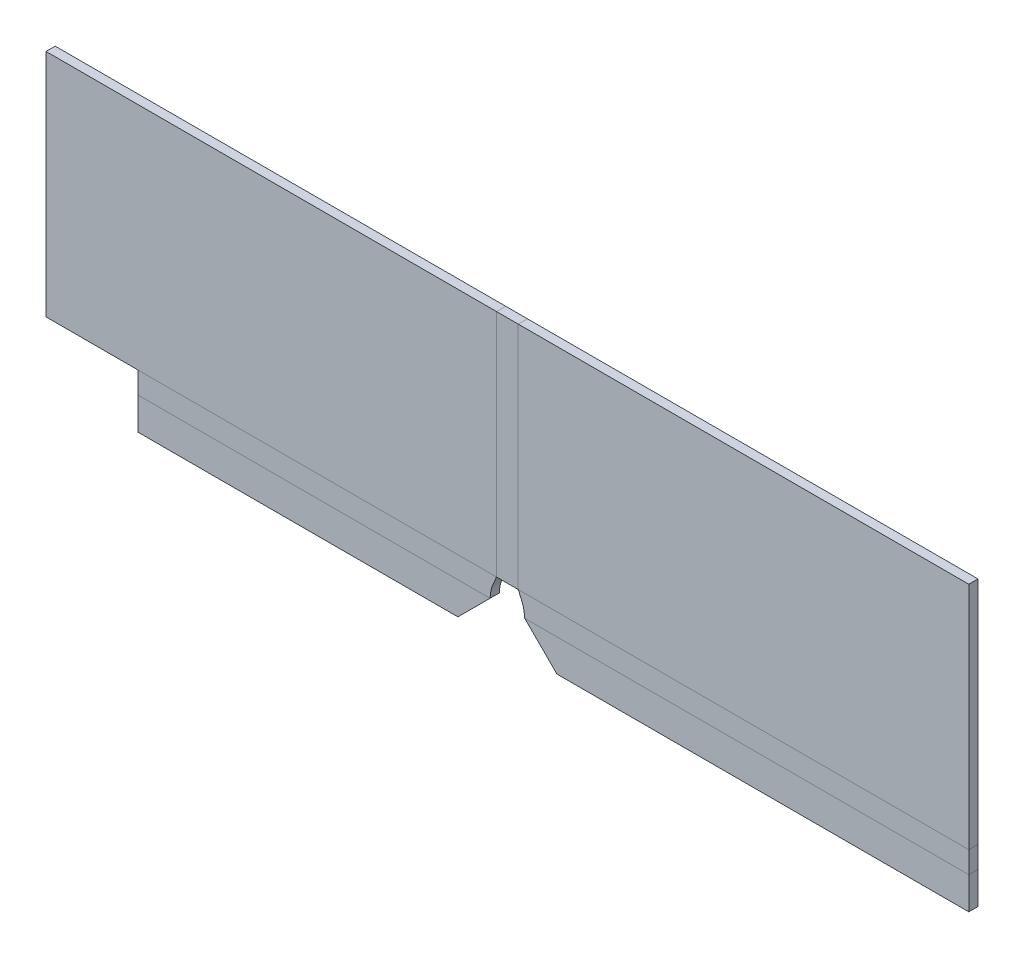
ISO-10303-21;
HEADER;
FILE_DESCRIPTION(('STEP AP214'),'2;1');
FILE_NAME('part.step','',(''),(''),'','','');
FILE_SCHEMA(('AUTOMOTIVE_DESIGN { 1 0 10303 214 1 1 1 1 }'));
ENDSEC;
DATA;
#1=APPLICATION_CONTEXT('core data for automotive mechanical design processes');
#2=APPLICATION_PROTOCOL_DEFINITION('international standard','automotive_design',2000,#1);
#3=PRODUCT_CONTEXT('',#1,'mechanical');
#4=PRODUCT('Part','Part','',(#3));
#5=PRODUCT_RELATED_PRODUCT_CATEGORY('part','',(#4));
#6=PRODUCT_DEFINITION_FORMATION('','',#4);
#7=PRODUCT_DEFINITION_CONTEXT('part definition',#1,'design');
#8=PRODUCT_DEFINITION('design','',#6,#7);
#9=PRODUCT_DEFINITION_SHAPE('','',#8);
#10=(LENGTH_UNIT() NAMED_UNIT(*) SI_UNIT(.MILLI.,.METRE.));
#11=(NAMED_UNIT(*) PLANE_ANGLE_UNIT() SI_UNIT($,.RADIAN.));
#12=(NAMED_UNIT(*) SI_UNIT($,.STERADIAN.) SOLID_ANGLE_UNIT());
#13=UNCERTAINTY_MEASURE_WITH_UNIT(LENGTH_MEASURE(1.E-05),#10,'distance_accuracy_value','');
#14=(GEOMETRIC_REPRESENTATION_CONTEXT(3) GLOBAL_UNCERTAINTY_ASSIGNED_CONTEXT((#13)) GLOBAL_UNIT_ASSIGNED_CONTEXT((#10,
#11,#12)) REPRESENTATION_CONTEXT('',''));
#15=CARTESIAN_POINT('',(0.,0.,0.));
#16=DIRECTION('',(0.,0.,1.));
#17=DIRECTION('',(1.,0.,0.));
#18=AXIS2_PLACEMENT_3D('',#15,#16,#17);
#19=CARTESIAN_POINT('',(1.28761101961531,0.,-2.));
#20=DIRECTION('',(0.,-1.,0.));
#21=DIRECTION('',(-1.,0.,0.));
#22=AXIS2_PLACEMENT_3D('',#19,#20,#21);
#23=PLANE('',#22);
#24=DIRECTION('',(0.,0.,1.));
#25=VECTOR('',#24,1.);
#26=CARTESIAN_POINT('',(-80.7123889803847,0.,1.05470321935075E-12));
#27=LINE('',#26,#25);
#28=CARTESIAN_POINT('',(-80.7123889803847,0.,1.05470321935075E-12));
#29=VERTEX_POINT('',#28);
#30=CARTESIAN_POINT('',(-80.7123889803847,0.,2.00000000000105));
#31=VERTEX_POINT('',#30);
#32=EDGE_CURVE('E104',#29,#31,#27,.T.);
#33=ORIENTED_EDGE('',*,*,#32,.T.);
#34=DIRECTION('',(1.,0.,0.));
#35=VECTOR('',#34,1.);
#36=CARTESIAN_POINT('',(-100.712388980385,0.,2.00000000000012));
#37=LINE('',#36,#35);
#38=CARTESIAN_POINT('',(-100.712388980385,0.,2.00000000000012));
#39=VERTEX_POINT('',#38);
#40=EDGE_CURVE('E92',#39,#31,#37,.T.);
#41=ORIENTED_EDGE('',*,*,#40,.F.);
#42=DIRECTION('',(0.,0.,-1.));
#43=VECTOR('',#42,1.);
#44=CARTESIAN_POINT('',(-100.712388980385,0.,2.00000000000012));
#45=LINE('',#44,#43);
#46=CARTESIAN_POINT('',(-100.712388980385,0.,1.24321427607463E-13));
#47=VERTEX_POINT('',#46);
#48=EDGE_CURVE('E103',#39,#47,#45,.T.);
#49=ORIENTED_EDGE('',*,*,#48,.T.);
#50=DIRECTION('',(1.,0.,0.));
#51=VECTOR('',#50,1.);
#52=CARTESIAN_POINT('',(-100.712388980385,0.,1.24321427607463E-13));
#53=LINE('',#52,#51);
#54=EDGE_CURVE('E109',#47,#29,#53,.T.);
#55=ORIENTED_EDGE('',*,*,#54,.T.);
#56=EDGE_LOOP('',(#33,#41,#49,#55));
#57=FACE_BOUND('',#56,.T.);
#58=ADVANCED_FACE('F51',(#57),#23,.T.);
#59=CARTESIAN_POINT('',(-100.712388980385,50.,1.24321427607463E-13));
#60=DIRECTION('',(0.,0.,-1.));
#61=DIRECTION('',(-1.,0.,0.));
#62=AXIS2_PLACEMENT_3D('',#59,#60,#61);
#63=PLANE('',#62);
#64=ORIENTED_EDGE('',*,*,#54,.F.);
#65=DIRECTION('',(0.,-1.,0.));
#66=VECTOR('',#65,1.);
#67=CARTESIAN_POINT('',(-100.712388980385,50.,1.24321427607463E-13));
#68=LINE('',#67,#66);
#69=CARTESIAN_POINT('',(-100.712388980385,50.,1.24321427607463E-13));
#70=VERTEX_POINT('',#69);
#71=EDGE_CURVE('E98',#70,#47,#68,.T.);
#72=ORIENTED_EDGE('',*,*,#71,.F.);
#73=DIRECTION('',(1.,0.,0.));
#74=VECTOR('',#73,1.);
#75=CARTESIAN_POINT('',(-100.712388980385,50.,1.24321427607463E-13));
#76=LINE('',#75,#74);
#77=CARTESIAN_POINT('',(-2.71238898038471,50.,0.));
#78=VERTEX_POINT('',#77);
#79=EDGE_CURVE('E105',#70,#78,#76,.T.);
#80=ORIENTED_EDGE('',*,*,#79,.T.);
#81=DIRECTION('',(0.,-1.,0.));
#82=VECTOR('',#81,1.);
#83=CARTESIAN_POINT('',(-2.71238898038469,50.,0.));
#84=LINE('',#83,#82);
#85=CARTESIAN_POINT('',(-2.71238898038469,0.,0.));
#86=VERTEX_POINT('',#85);
#87=EDGE_CURVE('E118',#78,#86,#84,.T.);
#88=ORIENTED_EDGE('',*,*,#87,.T.);
#89=DIRECTION('',(-1.,0.,0.));
#90=VECTOR('',#89,1.);
#91=CARTESIAN_POINT('',(-2.71238898038469,0.,0.));
#92=LINE('',#91,#90);
#93=EDGE_CURVE('E116',#86,#29,#92,.T.);
#94=ORIENTED_EDGE('',*,*,#93,.T.);
#95=EDGE_LOOP('',(#64,#72,#80,#88,#94));
#96=FACE_BOUND('',#95,.T.);
#97=ADVANCED_FACE('F233',(#96),#63,.T.);
#98=CARTESIAN_POINT('',(-100.712388980385,50.,2.00000000000012));
#99=DIRECTION('',(-1.,0.,0.));
#100=DIRECTION('',(0.,0.,1.));
#101=AXIS2_PLACEMENT_3D('',#98,#99,#100);
#102=PLANE('',#101);
#103=ORIENTED_EDGE('',*,*,#48,.F.);
#104=DIRECTION('',(0.,-1.,0.));
#105=VECTOR('',#104,1.);
#106=CARTESIAN_POINT('',(-100.712388980385,50.,2.00000000000012));
#107=LINE('',#106,#105);
#108=CARTESIAN_POINT('',(-100.712388980385,50.,2.00000000000012));
#109=VERTEX_POINT('',#108);
#110=EDGE_CURVE('E77',#109,#39,#107,.T.);
#111=ORIENTED_EDGE('',*,*,#110,.F.);
#112=DIRECTION('',(0.,0.,-1.));
#113=VECTOR('',#112,1.);
#114=CARTESIAN_POINT('',(-100.712388980385,50.,2.00000000000012));
#115=LINE('',#114,#113);
#116=EDGE_CURVE('E615',#109,#70,#115,.T.);
#117=ORIENTED_EDGE('',*,*,#116,.T.);
#118=ORIENTED_EDGE('',*,*,#71,.T.);
#119=EDGE_LOOP('',(#103,#111,#117,#118));
#120=FACE_BOUND('',#119,.T.);
#121=ADVANCED_FACE('F107',(#120),#102,.T.);
#122=CARTESIAN_POINT('',(-100.712388980385,50.,2.00000000000012));
#123=DIRECTION('',(0.,0.,-1.));
#124=DIRECTION('',(-1.,0.,0.));
#125=AXIS2_PLACEMENT_3D('',#122,#123,#124);
#126=PLANE('',#125);
#127=ORIENTED_EDGE('',*,*,#40,.T.);
#128=DIRECTION('',(-1.,0.,0.));
#129=VECTOR('',#128,1.);
#130=CARTESIAN_POINT('',(-2.71238898038467,0.,2.));
#131=LINE('',#130,#129);
#132=CARTESIAN_POINT('',(-2.71238898038471,0.,2.));
#133=VERTEX_POINT('',#132);
#134=EDGE_CURVE('E119',#133,#31,#131,.T.);
#135=ORIENTED_EDGE('',*,*,#134,.F.);
#136=DIRECTION('',(0.,-1.,0.));
#137=VECTOR('',#136,1.);
#138=CARTESIAN_POINT('',(-2.71238898038469,50.,2.));
#139=LINE('',#138,#137);
#140=CARTESIAN_POINT('',(-2.71238898038471,50.,2.));
#141=VERTEX_POINT('',#140);
#142=EDGE_CURVE('E61',#141,#133,#139,.T.);
#143=ORIENTED_EDGE('',*,*,#142,.F.);
#144=DIRECTION('',(1.,0.,0.));
#145=VECTOR('',#144,1.);
#146=CARTESIAN_POINT('',(-100.712388980385,50.,2.00000000000012));
#147=LINE('',#146,#145);
#148=EDGE_CURVE('E96',#109,#141,#147,.T.);
#149=ORIENTED_EDGE('',*,*,#148,.F.);
#150=ORIENTED_EDGE('',*,*,#110,.T.);
#151=EDGE_LOOP('',(#127,#135,#143,#149,#150));
#152=FACE_BOUND('',#151,.T.);
#153=ADVANCED_FACE('F90',(#152),#126,.F.);
#154=CARTESIAN_POINT('',(-2.71238898038469,50.,-2.));
#155=DIRECTION('',(0.,-1.,0.));
#156=DIRECTION('',(0.,0.,1.));
#157=AXIS2_PLACEMENT_3D('',#154,#155,#156);
#158=PLANE('',#157);
#159=ORIENTED_EDGE('',*,*,#148,.T.);
#160=DIRECTION('',(0.,0.,-1.));
#161=VECTOR('',#160,1.);
#162=CARTESIAN_POINT('',(-2.71238898038469,50.,2.));
#163=LINE('',#162,#161);
#164=EDGE_CURVE('E240',#141,#78,#163,.T.);
#165=ORIENTED_EDGE('',*,*,#164,.T.);
#166=ORIENTED_EDGE('',*,*,#79,.F.);
#167=ORIENTED_EDGE('',*,*,#116,.F.);
#168=EDGE_LOOP('',(#159,#165,#166,#167));
#169=FACE_BOUND('',#168,.T.);
#170=ADVANCED_FACE('F582',(#169),#158,.F.);
#171=CARTESIAN_POINT('',(-2.71238898038471,0.,4.7787675583159E-13));
#172=CARTESIAN_POINT('',(-2.94388208310796,-0.49037765062356,4.78170424739874E-13));
#173=CARTESIAN_POINT('',(-3.14082009192283,-0.92557395766604,4.78420257539936E-13));
#174=CARTESIAN_POINT('',(-3.38439446428259,-1.49559640285815,4.78729252577694E-13));
#175=CARTESIAN_POINT('',(-3.45694714825876,-1.67180854869358,4.78821291896558E-13));
#176=CARTESIAN_POINT('',(-3.55281801400737,-1.91543376360383,4.78942912334271E-13));
#177=CARTESIAN_POINT('',(-3.58261527588762,-1.99319333460009,4.78980712723411E-13));
#178=CARTESIAN_POINT('',(-3.6240716286541,-2.10465944013377,4.79033303671976E-13));
#179=CARTESIAN_POINT('',(-3.63735048956728,-2.14095260015154,4.79050149048973E-13));
#180=CARTESIAN_POINT('',(-3.65645889592357,-2.19409902743801,4.79074389705682E-13));
#181=CARTESIAN_POINT('',(-3.66269338387342,-2.2115989510768,4.79082298689788E-13));
#182=CARTESIAN_POINT('',(-3.67184264454482,-2.23752550834995,4.79093905313749E-13));
#183=CARTESIAN_POINT('',(-3.67485865289306,-2.24611380607682,4.79097731379704E-13));
#184=CARTESIAN_POINT('',(-3.67933204760208,-2.25891542062087,4.79103406265586E-13));
#185=CARTESIAN_POINT('',(-3.68081474286953,-2.26316915346118,4.79105287192039E-13));
#186=CARTESIAN_POINT('',(-3.68376326079998,-2.27164967512637,4.79109027640594E-13));
#187=CARTESIAN_POINT('',(-3.68480804718455,-2.2746592443585,4.7911035304197E-13));
#188=CARTESIAN_POINT('',(-3.92712456764235,-2.97519844123942,4.79417752386421E-13));
#189=CARTESIAN_POINT('',(-4.07376325862765,-3.78596484111149,4.79603776176276E-13));
#190=CARTESIAN_POINT('',(-4.12660254277965,-4.71238898038463,4.7967080735219E-13));
#191=CARTESIAN_POINT('',(-2.71238898038471,0.,2.00000000000048));
#192=CARTESIAN_POINT('',(-2.94388208310796,-0.49037765062356,2.00000000000048));
#193=CARTESIAN_POINT('',(-3.14082009192283,-0.92557395766604,2.00000000000048));
#194=CARTESIAN_POINT('',(-3.38439446428259,-1.49559640285815,2.00000000000048));
#195=CARTESIAN_POINT('',(-3.45694714825876,-1.67180854869358,2.00000000000048));
#196=CARTESIAN_POINT('',(-3.55281801400736,-1.91543376360383,2.00000000000048));
#197=CARTESIAN_POINT('',(-3.58261527588762,-1.99319333460009,2.00000000000048));
#198=CARTESIAN_POINT('',(-3.6240716286541,-2.10465944013377,2.00000000000048));
#199=CARTESIAN_POINT('',(-3.63735048956728,-2.14095260015154,2.00000000000048));
#200=CARTESIAN_POINT('',(-3.65645889592356,-2.19409902743801,2.00000000000048));
#201=CARTESIAN_POINT('',(-3.66269338387342,-2.2115989510768,2.00000000000048));
#202=CARTESIAN_POINT('',(-3.67184264454482,-2.23752550834995,2.00000000000048));
#203=CARTESIAN_POINT('',(-3.67485865289306,-2.24611380607682,2.00000000000048));
#204=CARTESIAN_POINT('',(-3.67933204760208,-2.25891542062087,2.00000000000048));
#205=CARTESIAN_POINT('',(-3.68081474286952,-2.26316915346118,2.00000000000048));
#206=CARTESIAN_POINT('',(-3.68376326079997,-2.27164967512637,2.00000000000048));
#207=CARTESIAN_POINT('',(-3.68480804718455,-2.2746592443585,2.00000000000048));
#208=CARTESIAN_POINT('',(-3.92712456764235,-2.97519844123942,2.00000000000048));
#209=CARTESIAN_POINT('',(-4.07376325862764,-3.78596484111149,2.00000000000048));
#210=CARTESIAN_POINT('',(-4.12660254277965,-4.71238898038463,2.00000000000048));
#211=B_SPLINE_SURFACE_WITH_KNOTS('',1,3,((#171,#172,#173,#174,#175,#176,#177,#178,#179,#180,
#181,#182,#183,#184,#185,#186,#187,#188,#189,#190),(#191,#192,#193,#194,#195,#196,#197,#198,
#199,#200,#201,#202,#203,#204,#205,#206,#207,#208,#209,#210)),.UNSPECIFIED.,.F.,.F.,.F.,(2,2),
(4,2,2,2,2,2,2,2,2,4),(0.,1.),(0.,0.25,0.375,0.4375,0.46875,0.484375,0.4921875,0.49609375,0.5,
1.),.UNSPECIFIED.);
#212=CARTESIAN_POINT('',(-2.71238898038471,0.,4.7787675583159E-13));
#213=CARTESIAN_POINT('',(-2.71238898038471,0.,2.00000000000048));
#214=B_SPLINE_CURVE_WITH_KNOTS('',1,(#212,#213),.UNSPECIFIED.,.F.,.F.,(2,2),(0.,1.),.UNSPECIFIED.);
#215=EDGE_CURVE('E12',#133,#86,#214,.F.);
#216=CARTESIAN_POINT('',(-2.71238898038471,0.,2.00000000000048));
#217=CARTESIAN_POINT('',(-3.40686828855445,-1.47113295187067,2.00000000000048));
#218=CARTESIAN_POINT('',(-3.68668646982376,-2.28008978076843,2.00000000000048));
#219=CARTESIAN_POINT('',(-4.04734361655164,-3.32275277147491,2.00000000000048));
#220=CARTESIAN_POINT('',(-4.12660254277965,-4.71238898038463,2.00000000000048));
#221=B_SPLINE_CURVE_WITH_KNOTS('',2,(#216,#217,#218,#219,#220),.UNSPECIFIED.,.F.,.F.,(3,2,3),
(0.,0.5,1.),.UNSPECIFIED.);
#222=CARTESIAN_POINT('',(-4.1266025427796,-4.71238898038468,2.00000000000002));
#223=VERTEX_POINT('',#222);
#224=EDGE_CURVE('E202',#133,#223,#221,.T.);
#225=CARTESIAN_POINT('',(-4.12660254277965,-4.71238898038463,2.00000000000048));
#226=CARTESIAN_POINT('',(-4.12660254277965,-4.71238898038463,4.7967080735219E-13));
#227=B_SPLINE_CURVE_WITH_KNOTS('',1,(#225,#226),.UNSPECIFIED.,.F.,.F.,(2,2),(0.,1.),.UNSPECIFIED.);
#228=CARTESIAN_POINT('',(-4.12660254277962,-4.71238898038468,0.));
#229=VERTEX_POINT('',#228);
#230=EDGE_CURVE('E137',#229,#223,#227,.F.);
#231=CARTESIAN_POINT('',(-2.71238898038471,0.,4.7787675583159E-13));
#232=CARTESIAN_POINT('',(-3.40686828855445,-1.47113295187067,4.78757762556442E-13));
#233=CARTESIAN_POINT('',(-3.68668646982376,-2.28008978076843,4.79112735982625E-13));
#234=CARTESIAN_POINT('',(-4.04734361655164,-3.32275277147491,4.79570260588319E-13));
#235=CARTESIAN_POINT('',(-4.12660254277965,-4.71238898038463,4.7967080735219E-13));
#236=B_SPLINE_CURVE_WITH_KNOTS('',2,(#231,#232,#233,#234,#235),.UNSPECIFIED.,.F.,.F.,(3,2,3),
(0.,0.5,1.),.UNSPECIFIED.);
#237=EDGE_CURVE('E199',#86,#229,#236,.T.);
#238=ORIENTED_EDGE('',*,*,#215,.F.);
#239=ORIENTED_EDGE('',*,*,#224,.T.);
#240=ORIENTED_EDGE('',*,*,#230,.F.);
#241=ORIENTED_EDGE('',*,*,#237,.F.);
#242=EDGE_LOOP('',(#238,#239,#240,#241));
#243=FACE_BOUND('',#242,.T.);
#244=ADVANCED_FACE('F230',(#243),#211,.T.);
#245=CARTESIAN_POINT('',(-80.7123889803847,0.,1.05470321935075E-12));
#246=DIRECTION('',(-1.,0.,0.));
#247=DIRECTION('',(0.,1.,0.));
#248=AXIS2_PLACEMENT_3D('',#245,#246,#247);
#249=PLANE('',#248);
#250=DIRECTION('',(0.,1.,0.));
#251=VECTOR('',#250,1.);
#252=CARTESIAN_POINT('',(-80.7123889803847,-2.35619449019234,2.00000000000058));
#253=LINE('',#252,#251);
#254=CARTESIAN_POINT('',(-80.7123889803847,-4.71238898038469,2.00000000000105));
#255=VERTEX_POINT('',#254);
#256=EDGE_CURVE('E68',#255,#31,#253,.T.);
#257=ORIENTED_EDGE('',*,*,#256,.T.);
#258=ORIENTED_EDGE('',*,*,#32,.F.);
#259=DIRECTION('',(0.,1.,0.));
#260=VECTOR('',#259,1.);
#261=CARTESIAN_POINT('',(-80.7123889803847,0.,1.05470321935075E-12));
#262=LINE('',#261,#260);
#263=CARTESIAN_POINT('',(-80.7123889803847,-4.71238898038468,1.05470321935075E-12));
#264=VERTEX_POINT('',#263);
#265=EDGE_CURVE('E111',#264,#29,#262,.T.);
#266=ORIENTED_EDGE('',*,*,#265,.F.);
#267=DIRECTION('',(0.,0.,1.));
#268=VECTOR('',#267,1.);
#269=CARTESIAN_POINT('',(-80.7123889803847,-4.71238898038468,1.05497828643866E-12));
#270=LINE('',#269,#268);
#271=EDGE_CURVE('E130',#264,#255,#270,.T.);
#272=ORIENTED_EDGE('',*,*,#271,.T.);
#273=EDGE_LOOP('',(#257,#258,#266,#272));
#274=FACE_BOUND('',#273,.T.);
#275=ADVANCED_FACE('F180',(#274),#249,.T.);
#276=CARTESIAN_POINT('',(-41.7123889803847,-2.35619449019234,5.27351609675377E-13));
#277=DIRECTION('',(0.,0.,-1.));
#278=DIRECTION('',(-1.,0.,0.));
#279=AXIS2_PLACEMENT_3D('',#276,#277,#278);
#280=PLANE('',#279);
#281=DIRECTION('',(-1.,0.,0.));
#282=VECTOR('',#281,1.);
#283=CARTESIAN_POINT('',(-2.71238898038469,-4.71238898038468,0.));
#284=LINE('',#283,#282);
#285=EDGE_CURVE('E127',#229,#264,#284,.T.);
#286=ORIENTED_EDGE('',*,*,#285,.T.);
#287=ORIENTED_EDGE('',*,*,#265,.T.);
#288=ORIENTED_EDGE('',*,*,#93,.F.);
#289=ORIENTED_EDGE('',*,*,#237,.T.);
#290=EDGE_LOOP('',(#286,#287,#288,#289));
#291=FACE_BOUND('',#290,.T.);
#292=ADVANCED_FACE('F175',(#291),#280,.T.);
#293=CARTESIAN_POINT('',(-41.7123889803847,-2.35619449019234,2.00000000000053));
#294=DIRECTION('',(0.,0.,-1.));
#295=DIRECTION('',(-1.,0.,0.));
#296=AXIS2_PLACEMENT_3D('',#293,#294,#295);
#297=PLANE('',#296);
#298=DIRECTION('',(-1.,0.,0.));
#299=VECTOR('',#298,1.);
#300=CARTESIAN_POINT('',(-2.71238898038467,-4.71238898038468,2.));
#301=LINE('',#300,#299);
#302=EDGE_CURVE('E152',#223,#255,#301,.T.);
#303=ORIENTED_EDGE('',*,*,#302,.F.);
#304=ORIENTED_EDGE('',*,*,#224,.F.);
#305=ORIENTED_EDGE('',*,*,#134,.T.);
#306=ORIENTED_EDGE('',*,*,#256,.F.);
#307=EDGE_LOOP('',(#303,#304,#305,#306));
#308=FACE_BOUND('',#307,.T.);
#309=ADVANCED_FACE('F179',(#308),#297,.F.);
#310=CARTESIAN_POINT('',(-2.71238898038469,-11.7123889803847,0.));
#311=DIRECTION('',(0.,-1.,0.));
#312=DIRECTION('',(1.,0.,0.));
#313=AXIS2_PLACEMENT_3D('',#310,#311,#312);
#314=PLANE('',#313);
#315=DIRECTION('',(0.,0.,1.));
#316=VECTOR('',#315,1.);
#317=CARTESIAN_POINT('',(-80.7123889803846,-11.7123889803847,1.05454460556966E-12));
#318=LINE('',#317,#316);
#319=CARTESIAN_POINT('',(-80.7123889803846,-11.7123889803847,1.05454460556966E-12));
#320=VERTEX_POINT('',#319);
#321=CARTESIAN_POINT('',(-80.7123889803846,-11.7123889803847,2.00000000000105));
#322=VERTEX_POINT('',#321);
#323=EDGE_CURVE('E341',#320,#322,#318,.T.);
#324=ORIENTED_EDGE('',*,*,#323,.F.);
#325=DIRECTION('',(1.,0.,0.));
#326=VECTOR('',#325,1.);
#327=CARTESIAN_POINT('',(-2.71238898038469,-11.7123889803847,0.));
#328=LINE('',#327,#326);
#329=CARTESIAN_POINT('',(-11.1266025427794,-11.7123889803847,1.13482026910797E-13));
#330=VERTEX_POINT('',#329);
#331=EDGE_CURVE('E138',#330,#320,#328,.F.);
#332=ORIENTED_EDGE('',*,*,#331,.F.);
#333=DIRECTION('',(0.,0.,1.));
#334=VECTOR('',#333,1.);
#335=CARTESIAN_POINT('',(-11.1266025427794,-11.7123889803847,1.13482026910797E-13));
#336=LINE('',#335,#334);
#337=CARTESIAN_POINT('',(-11.1266025427794,-11.7123889803847,2.00000000000011));
#338=VERTEX_POINT('',#337);
#339=EDGE_CURVE('E335',#330,#338,#336,.T.);
#340=ORIENTED_EDGE('',*,*,#339,.T.);
#341=DIRECTION('',(1.,0.,0.));
#342=VECTOR('',#341,1.);
#343=CARTESIAN_POINT('',(-2.71238898038467,-11.7123889803847,2.));
#344=LINE('',#343,#342);
#345=EDGE_CURVE('E346',#338,#322,#344,.F.);
#346=ORIENTED_EDGE('',*,*,#345,.T.);
#347=EDGE_LOOP('',(#324,#332,#340,#346));
#348=FACE_BOUND('',#347,.T.);
#349=ADVANCED_FACE('F563',(#348),#314,.T.);
#350=CARTESIAN_POINT('',(-2.71238898038469,-11.7123889803847,0.));
#351=DIRECTION('',(0.,0.,1.));
#352=DIRECTION('',(0.,-1.,0.));
#353=AXIS2_PLACEMENT_3D('',#350,#351,#352);
#354=PLANE('',#353);
#355=ORIENTED_EDGE('',*,*,#285,.F.);
#356=DIRECTION('',(0.707106781186538,0.707106781186557,0.));
#357=VECTOR('',#356,1.);
#358=CARTESIAN_POINT('',(-6.91949576158218,-7.50528219918731,0.));
#359=LINE('',#358,#357);
#360=EDGE_CURVE('E134',#330,#229,#359,.T.);
#361=ORIENTED_EDGE('',*,*,#360,.F.);
#362=ORIENTED_EDGE('',*,*,#331,.T.);
#363=DIRECTION('',(0.,-1.,0.));
#364=VECTOR('',#363,1.);
#365=CARTESIAN_POINT('',(-80.7123889803846,-11.7123889803856,1.05454460556966E-12));
#366=LINE('',#365,#364);
#367=EDGE_CURVE('E331',#264,#320,#366,.T.);
#368=ORIENTED_EDGE('',*,*,#367,.F.);
#369=EDGE_LOOP('',(#355,#361,#362,#368));
#370=FACE_BOUND('',#369,.T.);
#371=ADVANCED_FACE('F165',(#370),#354,.F.);
#372=CARTESIAN_POINT('',(-6.91949576158218,-7.50528219918731,0.));
#373=DIRECTION('',(0.707106781186557,-0.707106781186538,0.));
#374=DIRECTION('',(0.707106781186538,0.707106781186557,0.));
#375=AXIS2_PLACEMENT_3D('',#372,#373,#374);
#376=PLANE('',#375);
#377=ORIENTED_EDGE('',*,*,#339,.F.);
#378=ORIENTED_EDGE('',*,*,#360,.T.);
#379=ORIENTED_EDGE('',*,*,#230,.T.);
#380=DIRECTION('',(0.707106781186538,0.707106781186557,0.));
#381=VECTOR('',#380,1.);
#382=CARTESIAN_POINT('',(-6.91949576158215,-7.50528219918731,2.00000000000006));
#383=LINE('',#382,#381);
#384=EDGE_CURVE('E342',#338,#223,#383,.T.);
#385=ORIENTED_EDGE('',*,*,#384,.F.);
#386=EDGE_LOOP('',(#377,#378,#379,#385));
#387=FACE_BOUND('',#386,.T.);
#388=ADVANCED_FACE('F154',(#387),#376,.T.);
#389=CARTESIAN_POINT('',(-2.71238898038467,-11.7123889803847,2.));
#390=DIRECTION('',(0.,0.,1.));
#391=DIRECTION('',(0.,-1.,0.));
#392=AXIS2_PLACEMENT_3D('',#389,#390,#391);
#393=PLANE('',#392);
#394=ORIENTED_EDGE('',*,*,#302,.T.);
#395=DIRECTION('',(0.,-1.,0.));
#396=VECTOR('',#395,1.);
#397=CARTESIAN_POINT('',(-80.7123889803847,-11.7123889803847,2.00000000000105));
#398=LINE('',#397,#396);
#399=EDGE_CURVE('E333',#255,#322,#398,.T.);
#400=ORIENTED_EDGE('',*,*,#399,.T.);
#401=ORIENTED_EDGE('',*,*,#345,.F.);
#402=ORIENTED_EDGE('',*,*,#384,.T.);
#403=EDGE_LOOP('',(#394,#400,#401,#402));
#404=FACE_BOUND('',#403,.T.);
#405=ADVANCED_FACE('F164',(#404),#393,.T.);
#406=CARTESIAN_POINT('',(-80.7123889803846,-11.7123889803856,1.05454460556966E-12));
#407=DIRECTION('',(-1.,0.,0.));
#408=DIRECTION('',(0.,-1.,0.));
#409=AXIS2_PLACEMENT_3D('',#406,#407,#408);
#410=PLANE('',#409);
#411=ORIENTED_EDGE('',*,*,#367,.T.);
#412=ORIENTED_EDGE('',*,*,#323,.T.);
#413=ORIENTED_EDGE('',*,*,#399,.F.);
#414=ORIENTED_EDGE('',*,*,#271,.F.);
#415=EDGE_LOOP('',(#411,#412,#413,#414));
#416=FACE_BOUND('',#415,.T.);
#417=ADVANCED_FACE('F169',(#416),#410,.T.);
#418=CARTESIAN_POINT('',(100.,-11.7123889803847,0.));
#419=DIRECTION('',(-1.,0.,0.));
#420=DIRECTION('',(0.,-1.,0.));
#421=AXIS2_PLACEMENT_3D('',#418,#419,#420);
#422=PLANE('',#421);
#423=DIRECTION('',(0.,0.,1.));
#424=VECTOR('',#423,1.);
#425=CARTESIAN_POINT('',(100.,-11.7123889803847,0.));
#426=LINE('',#425,#424);
#427=CARTESIAN_POINT('',(100.,-11.7123889803847,0.));
#428=VERTEX_POINT('',#427);
#429=CARTESIAN_POINT('',(100.,-11.7123889803847,2.));
#430=VERTEX_POINT('',#429);
#431=EDGE_CURVE('E505',#428,#430,#426,.T.);
#432=ORIENTED_EDGE('',*,*,#431,.F.);
#433=DIRECTION('',(0.,-1.,0.));
#434=VECTOR('',#433,1.);
#435=CARTESIAN_POINT('',(100.,-11.7123889803847,0.));
#436=LINE('',#435,#434);
#437=CARTESIAN_POINT('',(100.,-4.71238898038468,0.));
#438=VERTEX_POINT('',#437);
#439=EDGE_CURVE('E510',#428,#438,#436,.F.);
#440=ORIENTED_EDGE('',*,*,#439,.T.);
#441=DIRECTION('',(0.,0.,1.));
#442=VECTOR('',#441,1.);
#443=CARTESIAN_POINT('',(100.,-4.71238898038468,0.));
#444=LINE('',#443,#442);
#445=CARTESIAN_POINT('',(100.,-4.71238898038468,2.));
#446=VERTEX_POINT('',#445);
#447=EDGE_CURVE('E507',#438,#446,#444,.T.);
#448=ORIENTED_EDGE('',*,*,#447,.T.);
#449=DIRECTION('',(0.,-1.,0.));
#450=VECTOR('',#449,1.);
#451=CARTESIAN_POINT('',(100.,-11.7123889803847,2.));
#452=LINE('',#451,#450);
#453=EDGE_CURVE('E490',#430,#446,#452,.F.);
#454=ORIENTED_EDGE('',*,*,#453,.F.);
#455=EDGE_LOOP('',(#432,#440,#448,#454));
#456=FACE_BOUND('',#455,.T.);
#457=ADVANCED_FACE('F173',(#456),#422,.F.);
#458=CARTESIAN_POINT('',(100.,-11.7123889803847,0.));
#459=DIRECTION('',(0.,-1.,0.));
#460=DIRECTION('',(1.,0.,0.));
#461=AXIS2_PLACEMENT_3D('',#458,#459,#460);
#462=PLANE('',#461);
#463=DIRECTION('',(0.,0.,1.));
#464=VECTOR('',#463,1.);
#465=CARTESIAN_POINT('',(10.4142135624258,-11.7123889803847,0.));
#466=LINE('',#465,#464);
#467=CARTESIAN_POINT('',(10.4142135624258,-11.7123889803847,0.));
#468=VERTEX_POINT('',#467);
#469=CARTESIAN_POINT('',(10.4142135624258,-11.7123889803847,2.));
#470=VERTEX_POINT('',#469);
#471=EDGE_CURVE('E474',#468,#470,#466,.T.);
#472=ORIENTED_EDGE('',*,*,#471,.F.);
#473=DIRECTION('',(1.,0.,0.));
#474=VECTOR('',#473,1.);
#475=CARTESIAN_POINT('',(100.,-11.7123889803847,0.));
#476=LINE('',#475,#474);
#477=EDGE_CURVE('E479',#428,#468,#476,.F.);
#478=ORIENTED_EDGE('',*,*,#477,.F.);
#479=ORIENTED_EDGE('',*,*,#431,.T.);
#480=DIRECTION('',(1.,0.,0.));
#481=VECTOR('',#480,1.);
#482=CARTESIAN_POINT('',(100.,-11.7123889803847,2.));
#483=LINE('',#482,#481);
#484=EDGE_CURVE('E500',#430,#470,#483,.F.);
#485=ORIENTED_EDGE('',*,*,#484,.T.);
#486=EDGE_LOOP('',(#472,#478,#479,#485));
#487=FACE_BOUND('',#486,.T.);
#488=ADVANCED_FACE('F374',(#487),#462,.T.);
#489=CARTESIAN_POINT('',(100.,-11.7123889803847,2.));
#490=DIRECTION('',(0.,0.,1.));
#491=DIRECTION('',(0.,-1.,0.));
#492=AXIS2_PLACEMENT_3D('',#489,#490,#491);
#493=PLANE('',#492);
#494=DIRECTION('',(-1.,0.,0.));
#495=VECTOR('',#494,1.);
#496=CARTESIAN_POINT('',(100.,-4.71238898038468,2.));
#497=LINE('',#496,#495);
#498=CARTESIAN_POINT('',(3.4142135624258,-4.71238898038469,2.));
#499=VERTEX_POINT('',#498);
#500=EDGE_CURVE('E495',#446,#499,#497,.T.);
#501=ORIENTED_EDGE('',*,*,#500,.T.);
#502=DIRECTION('',(0.707106781186548,-0.707106781186547,0.));
#503=VECTOR('',#502,1.);
#504=CARTESIAN_POINT('',(55.207106781213,-56.5052821991718,2.));
#505=LINE('',#504,#503);
#506=EDGE_CURVE('E492',#499,#470,#505,.T.);
#507=ORIENTED_EDGE('',*,*,#506,.T.);
#508=ORIENTED_EDGE('',*,*,#484,.F.);
#509=ORIENTED_EDGE('',*,*,#453,.T.);
#510=EDGE_LOOP('',(#501,#507,#508,#509));
#511=FACE_BOUND('',#510,.T.);
#512=ADVANCED_FACE('F378',(#511),#493,.T.);
#513=CARTESIAN_POINT('',(100.,-4.71238898038468,0.));
#514=DIRECTION('',(1.,-4.82384126688634E-12,0.));
#515=DIRECTION('',(-4.82384126688634E-12,-1.,0.));
#516=AXIS2_PLACEMENT_3D('',#513,#514,#515);
#517=PLANE('',#516);
#518=DIRECTION('',(0.,0.,1.));
#519=VECTOR('',#518,1.);
#520=CARTESIAN_POINT('',(100.,0.,0.));
#521=LINE('',#520,#519);
#522=CARTESIAN_POINT('',(100.000000000023,0.,0.));
#523=VERTEX_POINT('',#522);
#524=CARTESIAN_POINT('',(100.,0.,2.));
#525=VERTEX_POINT('',#524);
#526=EDGE_CURVE('E487',#523,#525,#521,.T.);
#527=ORIENTED_EDGE('',*,*,#526,.T.);
#528=DIRECTION('',(0.,1.,0.));
#529=VECTOR('',#528,1.);
#530=CARTESIAN_POINT('',(100.000000000023,-2.35619449019234,2.));
#531=LINE('',#530,#529);
#532=EDGE_CURVE('E484',#525,#446,#531,.F.);
#533=ORIENTED_EDGE('',*,*,#532,.T.);
#534=ORIENTED_EDGE('',*,*,#447,.F.);
#535=DIRECTION('',(-4.82384126688634E-12,-1.,0.));
#536=VECTOR('',#535,1.);
#537=CARTESIAN_POINT('',(100.,-4.71238898038468,0.));
#538=LINE('',#537,#536);
#539=EDGE_CURVE('E457',#523,#438,#538,.T.);
#540=ORIENTED_EDGE('',*,*,#539,.F.);
#541=EDGE_LOOP('',(#527,#533,#534,#540));
#542=FACE_BOUND('',#541,.T.);
#543=ADVANCED_FACE('F382',(#542),#517,.T.);
#544=CARTESIAN_POINT('',(100.,-11.7123889803847,0.));
#545=DIRECTION('',(0.,0.,1.));
#546=DIRECTION('',(0.,-1.,0.));
#547=AXIS2_PLACEMENT_3D('',#544,#545,#546);
#548=PLANE('',#547);
#549=DIRECTION('',(-1.,0.,0.));
#550=VECTOR('',#549,1.);
#551=CARTESIAN_POINT('',(100.,-4.71238898038468,0.));
#552=LINE('',#551,#550);
#553=CARTESIAN_POINT('',(3.41421356243177,-4.71238898038468,0.));
#554=VERTEX_POINT('',#553);
#555=EDGE_CURVE('E465',#438,#554,#552,.T.);
#556=ORIENTED_EDGE('',*,*,#555,.F.);
#557=ORIENTED_EDGE('',*,*,#439,.F.);
#558=ORIENTED_EDGE('',*,*,#477,.T.);
#559=DIRECTION('',(0.707106781186548,-0.707106781186547,0.));
#560=VECTOR('',#559,1.);
#561=CARTESIAN_POINT('',(55.207106781213,-56.5052821991718,0.));
#562=LINE('',#561,#560);
#563=EDGE_CURVE('E476',#554,#468,#562,.T.);
#564=ORIENTED_EDGE('',*,*,#563,.F.);
#565=EDGE_LOOP('',(#556,#557,#558,#564));
#566=FACE_BOUND('',#565,.T.);
#567=ADVANCED_FACE('F386',(#566),#548,.F.);
#568=CARTESIAN_POINT('',(55.207106781213,-56.5052821991718,0.));
#569=DIRECTION('',(-0.707106781186547,-0.707106781186548,0.));
#570=DIRECTION('',(0.707106781186548,-0.707106781186547,0.));
#571=AXIS2_PLACEMENT_3D('',#568,#569,#570);
#572=PLANE('',#571);
#573=ORIENTED_EDGE('',*,*,#563,.T.);
#574=ORIENTED_EDGE('',*,*,#471,.T.);
#575=ORIENTED_EDGE('',*,*,#506,.F.);
#576=CARTESIAN_POINT('',(3.41421356243179,-4.7123889803847,0.));
#577=CARTESIAN_POINT('',(3.41421356243179,-4.7123889803847,2.));
#578=B_SPLINE_CURVE_WITH_KNOTS('',1,(#576,#577),.UNSPECIFIED.,.F.,.F.,(2,2),(0.,1.),.UNSPECIFIED.);
#579=EDGE_CURVE('E468',#554,#499,#578,.T.);
#580=ORIENTED_EDGE('',*,*,#579,.F.);
#581=EDGE_LOOP('',(#573,#574,#575,#580));
#582=FACE_BOUND('',#581,.T.);
#583=ADVANCED_FACE('F390',(#582),#572,.T.);
#584=CARTESIAN_POINT('',(51.0000000000114,-2.35619449019234,2.));
#585=DIRECTION('',(0.,0.,-1.));
#586=DIRECTION('',(-1.,0.,0.));
#587=AXIS2_PLACEMENT_3D('',#584,#585,#586);
#588=PLANE('',#587);
#589=ORIENTED_EDGE('',*,*,#500,.F.);
#590=ORIENTED_EDGE('',*,*,#532,.F.);
#591=DIRECTION('',(1.,0.,0.));
#592=VECTOR('',#591,1.);
#593=CARTESIAN_POINT('',(0.,0.,2.));
#594=LINE('',#593,#592);
#595=CARTESIAN_POINT('',(2.,0.,2.));
#596=VERTEX_POINT('',#595);
#597=EDGE_CURVE('E445',#596,#525,#594,.T.);
#598=ORIENTED_EDGE('',*,*,#597,.F.);
#599=CARTESIAN_POINT('',(3.41421356243179,-4.7123889803847,2.));
#600=CARTESIAN_POINT('',(3.34635629160596,-3.36247974782419,2.));
#601=CARTESIAN_POINT('',(2.97389813324261,-2.28024735438092,2.));
#602=CARTESIAN_POINT('',(2.69790327354223,-1.47830337521262,2.));
#603=CARTESIAN_POINT('',(2.000000000004,0.,2.));
#604=B_SPLINE_CURVE_WITH_KNOTS('',2,(#599,#600,#601,#602,#603),.UNSPECIFIED.,.F.,.F.,(3,2,3),
(0.,0.5,1.),.UNSPECIFIED.);
#605=EDGE_CURVE('E421',#499,#596,#604,.T.);
#606=ORIENTED_EDGE('',*,*,#605,.F.);
#607=EDGE_LOOP('',(#589,#590,#598,#606));
#608=FACE_BOUND('',#607,.T.);
#609=ADVANCED_FACE('F395',(#608),#588,.F.);
#610=CARTESIAN_POINT('',(100.,50.,0.));
#611=DIRECTION('',(1.,0.,0.));
#612=DIRECTION('',(0.,0.,-1.));
#613=AXIS2_PLACEMENT_3D('',#610,#611,#612);
#614=PLANE('',#613);
#615=ORIENTED_EDGE('',*,*,#526,.F.);
#616=DIRECTION('',(0.,-1.,0.));
#617=VECTOR('',#616,1.);
#618=CARTESIAN_POINT('',(100.,50.,0.));
#619=LINE('',#618,#617);
#620=CARTESIAN_POINT('',(100.,50.,0.));
#621=VERTEX_POINT('',#620);
#622=EDGE_CURVE('E451',#621,#523,#619,.T.);
#623=ORIENTED_EDGE('',*,*,#622,.F.);
#624=DIRECTION('',(0.,0.,1.));
#625=VECTOR('',#624,1.);
#626=CARTESIAN_POINT('',(100.,50.,0.));
#627=LINE('',#626,#625);
#628=CARTESIAN_POINT('',(100.,50.,2.));
#629=VERTEX_POINT('',#628);
#630=EDGE_CURVE('E472',#621,#629,#627,.T.);
#631=ORIENTED_EDGE('',*,*,#630,.T.);
#632=DIRECTION('',(0.,-1.,0.));
#633=VECTOR('',#632,1.);
#634=CARTESIAN_POINT('',(100.,50.,2.));
#635=LINE('',#634,#633);
#636=EDGE_CURVE('E425',#629,#525,#635,.T.);
#637=ORIENTED_EDGE('',*,*,#636,.T.);
#638=EDGE_LOOP('',(#615,#623,#631,#637));
#639=FACE_BOUND('',#638,.T.);
#640=ADVANCED_FACE('F716',(#639),#614,.T.);
#641=CARTESIAN_POINT('',(3.41421356243179,-4.7123889803847,0.));
#642=CARTESIAN_POINT('',(3.39159447215652,-4.26241923619786,0.));
#643=CARTESIAN_POINT('',(3.34359197458644,-3.83475589527079,0.));
#644=CARTESIAN_POINT('',(3.23351311728915,-3.22672048876985,0.));
#645=CARTESIAN_POINT('',(3.19047431303302,-3.02961862075114,0.));
#646=CARTESIAN_POINT('',(3.11639732891328,-2.7423307199455,0.));
#647=CARTESIAN_POINT('',(3.09011853791744,-2.64796223654735,0.));
#648=CARTESIAN_POINT('',(3.0483206569898,-2.50850073675574,0.));
#649=CARTESIAN_POINT('',(3.03399141427493,-2.46236210770946,0.));
#650=CARTESIAN_POINT('',(3.01190262659416,-2.39367697046646,0.));
#651=CARTESIAN_POINT('',(3.0044405434325,-2.37086905910652,0.));
#652=CARTESIAN_POINT('',(2.99309868778788,-2.33678789364822,0.));
#653=CARTESIAN_POINT('',(2.98929328075598,-2.32544928875905,0.));
#654=CARTESIAN_POINT('',(2.98354798748262,-2.3084740568207,0.));
#655=CARTESIAN_POINT('',(2.9816266926039,-2.30282109207382,0.));
#656=CARTESIAN_POINT('',(2.97777170860464,-2.29152605437852,0.));
#657=CARTESIAN_POINT('',(2.97533560647022,-2.28442414593908,0.));
#658=CARTESIAN_POINT('',(2.78990156010902,-1.74561803493538,0.));
#659=CARTESIAN_POINT('',(2.46526884902948,-0.985535583475078,0.));
#660=CARTESIAN_POINT('',(2.000000000004,0.,0.));
#661=CARTESIAN_POINT('',(3.41421356243179,-4.7123889803847,2.));
#662=CARTESIAN_POINT('',(3.39159447215652,-4.26241923619786,2.));
#663=CARTESIAN_POINT('',(3.34359197458644,-3.83475589527079,2.));
#664=CARTESIAN_POINT('',(3.23351311728915,-3.22672048876985,2.));
#665=CARTESIAN_POINT('',(3.19047431303302,-3.02961862075114,2.));
#666=CARTESIAN_POINT('',(3.11639732891328,-2.7423307199455,2.));
#667=CARTESIAN_POINT('',(3.09011853791744,-2.64796223654735,2.));
#668=CARTESIAN_POINT('',(3.0483206569898,-2.50850073675574,2.));
#669=CARTESIAN_POINT('',(3.03399141427493,-2.46236210770946,2.));
#670=CARTESIAN_POINT('',(3.01190262659416,-2.39367697046646,2.));
#671=CARTESIAN_POINT('',(3.0044405434325,-2.37086905910652,2.));
#672=CARTESIAN_POINT('',(2.99309868778788,-2.33678789364822,2.));
#673=CARTESIAN_POINT('',(2.98929328075598,-2.32544928875905,2.));
#674=CARTESIAN_POINT('',(2.98354798748262,-2.3084740568207,2.));
#675=CARTESIAN_POINT('',(2.9816266926039,-2.30282109207382,2.));
#676=CARTESIAN_POINT('',(2.97777170860464,-2.29152605437852,2.));
#677=CARTESIAN_POINT('',(2.97533560647022,-2.28442414593908,2.));
#678=CARTESIAN_POINT('',(2.78990156010902,-1.74561803493538,2.));
#679=CARTESIAN_POINT('',(2.46526884902948,-0.985535583475078,2.));
#680=CARTESIAN_POINT('',(2.000000000004,0.,2.));
#681=B_SPLINE_SURFACE_WITH_KNOTS('',1,3,((#641,#642,#643,#644,#645,#646,#647,#648,#649,#650,
#651,#652,#653,#654,#655,#656,#657,#658,#659,#660),(#661,#662,#663,#664,#665,#666,#667,#668,
#669,#670,#671,#672,#673,#674,#675,#676,#677,#678,#679,#680)),.UNSPECIFIED.,.F.,.F.,.F.,(2,2),
(4,2,2,2,2,2,2,2,2,4),(0.,1.),(0.,0.25,0.375,0.4375,0.46875,0.484375,0.4921875,0.49609375,0.5,
1.),.UNSPECIFIED.);
#682=CARTESIAN_POINT('',(2.000000000004,0.,2.));
#683=CARTESIAN_POINT('',(2.000000000004,0.,0.));
#684=B_SPLINE_CURVE_WITH_KNOTS('',1,(#682,#683),.UNSPECIFIED.,.F.,.F.,(2,2),(0.,1.),.UNSPECIFIED.);
#685=CARTESIAN_POINT('',(2.,0.,0.));
#686=VERTEX_POINT('',#685);
#687=EDGE_CURVE('E424',#596,#686,#684,.T.);
#688=CARTESIAN_POINT('',(3.41421356243179,-4.7123889803847,0.));
#689=CARTESIAN_POINT('',(3.34635629160596,-3.36247974782419,0.));
#690=CARTESIAN_POINT('',(2.97389813324261,-2.28024735438092,0.));
#691=CARTESIAN_POINT('',(2.69790327354223,-1.47830337521262,0.));
#692=CARTESIAN_POINT('',(2.000000000004,0.,0.));
#693=B_SPLINE_CURVE_WITH_KNOTS('',2,(#688,#689,#690,#691,#692),.UNSPECIFIED.,.F.,.F.,(3,2,3),
(0.,0.5,1.),.UNSPECIFIED.);
#694=EDGE_CURVE('E426',#554,#686,#693,.T.);
#695=ORIENTED_EDGE('',*,*,#605,.T.);
#696=ORIENTED_EDGE('',*,*,#687,.T.);
#697=ORIENTED_EDGE('',*,*,#694,.F.);
#698=ORIENTED_EDGE('',*,*,#579,.T.);
#699=EDGE_LOOP('',(#695,#696,#697,#698));
#700=FACE_BOUND('',#699,.T.);
#701=ADVANCED_FACE('F527',(#700),#681,.T.);
#702=CARTESIAN_POINT('',(51.0000000000114,-2.35619449019234,0.));
#703=DIRECTION('',(0.,0.,-1.));
#704=DIRECTION('',(-1.,0.,0.));
#705=AXIS2_PLACEMENT_3D('',#702,#703,#704);
#706=PLANE('',#705);
#707=ORIENTED_EDGE('',*,*,#555,.T.);
#708=ORIENTED_EDGE('',*,*,#694,.T.);
#709=DIRECTION('',(1.,0.,0.));
#710=VECTOR('',#709,1.);
#711=CARTESIAN_POINT('',(0.,0.,0.));
#712=LINE('',#711,#710);
#713=EDGE_CURVE('E460',#686,#523,#712,.T.);
#714=ORIENTED_EDGE('',*,*,#713,.T.);
#715=ORIENTED_EDGE('',*,*,#539,.T.);
#716=EDGE_LOOP('',(#707,#708,#714,#715));
#717=FACE_BOUND('',#716,.T.);
#718=ADVANCED_FACE('F524',(#717),#706,.T.);
#719=CARTESIAN_POINT('',(0.,50.,0.));
#720=DIRECTION('',(0.,0.,-1.));
#721=DIRECTION('',(-1.,0.,0.));
#722=AXIS2_PLACEMENT_3D('',#719,#720,#721);
#723=PLANE('',#722);
#724=ORIENTED_EDGE('',*,*,#713,.F.);
#725=DIRECTION('',(0.,-1.,0.));
#726=VECTOR('',#725,1.);
#727=CARTESIAN_POINT('',(2.,50.,0.));
#728=LINE('',#727,#726);
#729=CARTESIAN_POINT('',(2.,50.,0.));
#730=VERTEX_POINT('',#729);
#731=EDGE_CURVE('E431',#730,#686,#728,.T.);
#732=ORIENTED_EDGE('',*,*,#731,.F.);
#733=DIRECTION('',(1.,0.,0.));
#734=VECTOR('',#733,1.);
#735=CARTESIAN_POINT('',(0.,50.,0.));
#736=LINE('',#735,#734);
#737=EDGE_CURVE('E450',#730,#621,#736,.T.);
#738=ORIENTED_EDGE('',*,*,#737,.T.);
#739=ORIENTED_EDGE('',*,*,#622,.T.);
#740=EDGE_LOOP('',(#724,#732,#738,#739));
#741=FACE_BOUND('',#740,.T.);
#742=ADVANCED_FACE('F519',(#741),#723,.T.);
#743=CARTESIAN_POINT('',(-2.,50.,-2.));
#744=DIRECTION('',(0.,1.,0.));
#745=DIRECTION('',(0.,0.,1.));
#746=AXIS2_PLACEMENT_3D('',#743,#744,#745);
#747=PLANE('',#746);
#748=ORIENTED_EDGE('',*,*,#737,.F.);
#749=DIRECTION('',(0.,0.,1.));
#750=VECTOR('',#749,1.);
#751=CARTESIAN_POINT('',(2.,50.,0.));
#752=LINE('',#751,#750);
#753=CARTESIAN_POINT('',(2.,50.,2.));
#754=VERTEX_POINT('',#753);
#755=EDGE_CURVE('E436',#730,#754,#752,.T.);
#756=ORIENTED_EDGE('',*,*,#755,.T.);
#757=DIRECTION('',(1.,0.,0.));
#758=VECTOR('',#757,1.);
#759=CARTESIAN_POINT('',(0.,50.,2.));
#760=LINE('',#759,#758);
#761=EDGE_CURVE('E440',#754,#629,#760,.T.);
#762=ORIENTED_EDGE('',*,*,#761,.T.);
#763=ORIENTED_EDGE('',*,*,#630,.F.);
#764=EDGE_LOOP('',(#748,#756,#762,#763));
#765=FACE_BOUND('',#764,.T.);
#766=ADVANCED_FACE('F448',(#765),#747,.T.);
#767=CARTESIAN_POINT('',(0.,50.,2.));
#768=DIRECTION('',(0.,0.,-1.));
#769=DIRECTION('',(-1.,0.,0.));
#770=AXIS2_PLACEMENT_3D('',#767,#768,#769);
#771=PLANE('',#770);
#772=ORIENTED_EDGE('',*,*,#597,.T.);
#773=ORIENTED_EDGE('',*,*,#636,.F.);
#774=ORIENTED_EDGE('',*,*,#761,.F.);
#775=DIRECTION('',(0.,-1.,0.));
#776=VECTOR('',#775,1.);
#777=CARTESIAN_POINT('',(2.,50.,2.));
#778=LINE('',#777,#776);
#779=EDGE_CURVE('E131',#754,#596,#778,.T.);
#780=ORIENTED_EDGE('',*,*,#779,.T.);
#781=EDGE_LOOP('',(#772,#773,#774,#780));
#782=FACE_BOUND('',#781,.T.);
#783=ADVANCED_FACE('F369',(#782),#771,.F.);
#784=CARTESIAN_POINT('',(-2.71238898038471,0.,0.));
#785=DIRECTION('',(0.,-1.,0.));
#786=DIRECTION('',(-1.,0.,0.));
#787=AXIS2_PLACEMENT_3D('',#784,#785,#786);
#788=PLANE('',#787);
#789=ORIENTED_EDGE('',*,*,#687,.F.);
#790=DIRECTION('',(-1.,0.,0.));
#791=VECTOR('',#790,1.);
#792=CARTESIAN_POINT('',(-0.356194490192347,0.,2.));
#793=LINE('',#792,#791);
#794=EDGE_CURVE('E218',#596,#133,#793,.T.);
#795=ORIENTED_EDGE('',*,*,#794,.T.);
#796=ORIENTED_EDGE('',*,*,#215,.T.);
#797=DIRECTION('',(-1.,0.,0.));
#798=VECTOR('',#797,1.);
#799=CARTESIAN_POINT('',(-2.71238898038471,0.,0.));
#800=LINE('',#799,#798);
#801=EDGE_CURVE('E214',#686,#86,#800,.T.);
#802=ORIENTED_EDGE('',*,*,#801,.F.);
#803=EDGE_LOOP('',(#789,#795,#796,#802));
#804=FACE_BOUND('',#803,.T.);
#805=ADVANCED_FACE('F211',(#804),#788,.T.);
#806=CARTESIAN_POINT('',(-2.71238898038471,50.,0.));
#807=DIRECTION('',(0.,1.,0.));
#808=DIRECTION('',(1.,0.,0.));
#809=AXIS2_PLACEMENT_3D('',#806,#807,#808);
#810=PLANE('',#809);
#811=ORIENTED_EDGE('',*,*,#164,.F.);
#812=DIRECTION('',(-1.,0.,0.));
#813=VECTOR('',#812,1.);
#814=CARTESIAN_POINT('',(-0.356194490192347,50.,2.));
#815=LINE('',#814,#813);
#816=EDGE_CURVE('E259',#141,#754,#815,.F.);
#817=ORIENTED_EDGE('',*,*,#816,.T.);
#818=ORIENTED_EDGE('',*,*,#755,.F.);
#819=DIRECTION('',(1.,0.,0.));
#820=VECTOR('',#819,1.);
#821=CARTESIAN_POINT('',(-2.71238898038471,50.,0.));
#822=LINE('',#821,#820);
#823=EDGE_CURVE('E429',#78,#730,#822,.T.);
#824=ORIENTED_EDGE('',*,*,#823,.F.);
#825=EDGE_LOOP('',(#811,#817,#818,#824));
#826=FACE_BOUND('',#825,.T.);
#827=ADVANCED_FACE('F368',(#826),#810,.T.);
#828=CARTESIAN_POINT('',(-0.356194490192347,25.,0.));
#829=DIRECTION('',(0.,0.,-1.));
#830=DIRECTION('',(-1.,0.,0.));
#831=AXIS2_PLACEMENT_3D('',#828,#829,#830);
#832=PLANE('',#831);
#833=ORIENTED_EDGE('',*,*,#823,.T.);
#834=ORIENTED_EDGE('',*,*,#731,.T.);
#835=ORIENTED_EDGE('',*,*,#801,.T.);
#836=ORIENTED_EDGE('',*,*,#87,.F.);
#837=EDGE_LOOP('',(#833,#834,#835,#836));
#838=FACE_BOUND('',#837,.T.);
#839=ADVANCED_FACE('F516',(#838),#832,.T.);
#840=CARTESIAN_POINT('',(-0.356194490192347,25.,2.));
#841=DIRECTION('',(0.,0.,-1.));
#842=DIRECTION('',(-1.,0.,0.));
#843=AXIS2_PLACEMENT_3D('',#840,#841,#842);
#844=PLANE('',#843);
#845=ORIENTED_EDGE('',*,*,#816,.F.);
#846=ORIENTED_EDGE('',*,*,#142,.T.);
#847=ORIENTED_EDGE('',*,*,#794,.F.);
#848=ORIENTED_EDGE('',*,*,#779,.F.);
#849=EDGE_LOOP('',(#845,#846,#847,#848));
#850=FACE_BOUND('',#849,.T.);
#851=ADVANCED_FACE('F253',(#850),#844,.F.);
#852=CLOSED_SHELL('',(#58,#97,#121,#153,#170,#244,#275,#292,#309,#349,#371,#388,#405,#417,#457,
#488,#512,#543,#567,#583,#609,#640,#701,#718,#742,#766,#783,#805,#827,#839,#851));
#853=MANIFOLD_SOLID_BREP('B2',#852);
#854=ADVANCED_BREP_SHAPE_REPRESENTATION('',(#18,#853),#14);
#855=SHAPE_DEFINITION_REPRESENTATION(#9,#854);
ENDSEC;
END-ISO-10303-21;
